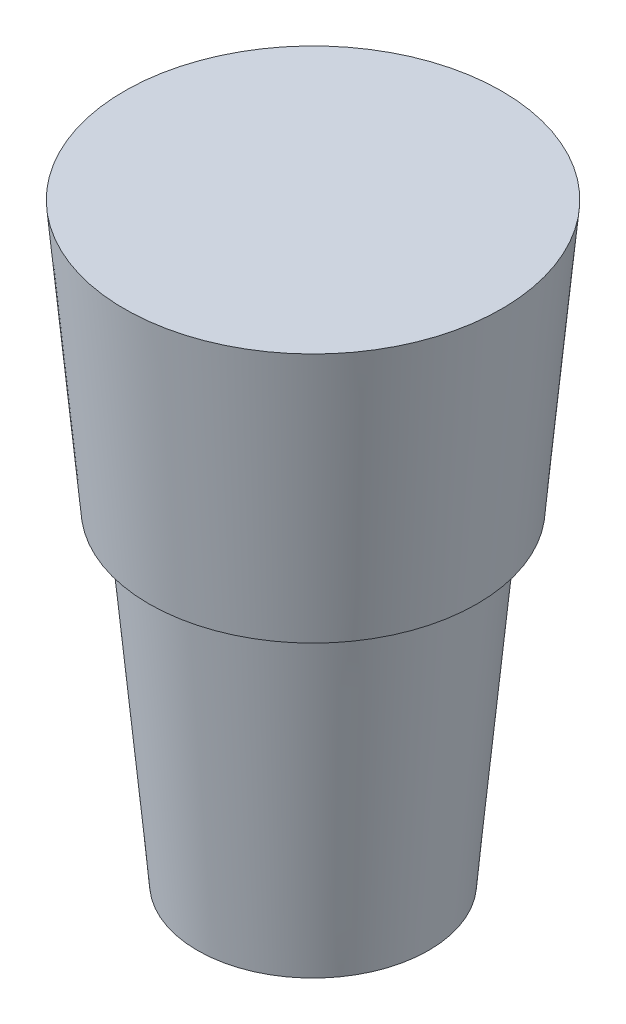
ISO-10303-21;
HEADER;
FILE_DESCRIPTION(('STEP AP214'),'2;1');
FILE_NAME('part.step','',(''),(''),'','','');
FILE_SCHEMA(('AUTOMOTIVE_DESIGN { 1 0 10303 214 1 1 1 1 }'));
ENDSEC;
DATA;
#1=APPLICATION_CONTEXT('core data for automotive mechanical design processes');
#2=APPLICATION_PROTOCOL_DEFINITION('international standard','automotive_design',2000,#1);
#3=PRODUCT_CONTEXT('',#1,'mechanical');
#4=PRODUCT('Part','Part','',(#3));
#5=PRODUCT_RELATED_PRODUCT_CATEGORY('part','',(#4));
#6=PRODUCT_DEFINITION_FORMATION('','',#4);
#7=PRODUCT_DEFINITION_CONTEXT('part definition',#1,'design');
#8=PRODUCT_DEFINITION('design','',#6,#7);
#9=PRODUCT_DEFINITION_SHAPE('','',#8);
#10=(LENGTH_UNIT() NAMED_UNIT(*) SI_UNIT(.MILLI.,.METRE.));
#11=(NAMED_UNIT(*) PLANE_ANGLE_UNIT() SI_UNIT($,.RADIAN.));
#12=(NAMED_UNIT(*) SI_UNIT($,.STERADIAN.) SOLID_ANGLE_UNIT());
#13=UNCERTAINTY_MEASURE_WITH_UNIT(LENGTH_MEASURE(1.E-05),#10,'distance_accuracy_value','');
#14=(GEOMETRIC_REPRESENTATION_CONTEXT(3) GLOBAL_UNCERTAINTY_ASSIGNED_CONTEXT((#13)) GLOBAL_UNIT_ASSIGNED_CONTEXT((#10,
#11,#12)) REPRESENTATION_CONTEXT('',''));
#15=CARTESIAN_POINT('',(0.,0.,0.));
#16=DIRECTION('',(0.,0.,1.));
#17=DIRECTION('',(1.,0.,0.));
#18=AXIS2_PLACEMENT_3D('',#15,#16,#17);
#19=CARTESIAN_POINT('',(-15.8031954179866,-39.1070249293181,0.));
#20=DIRECTION('',(0.,-1.,0.));
#21=DIRECTION('',(0.,0.,-1.));
#22=AXIS2_PLACEMENT_3D('',#19,#20,#21);
#23=PLANE('',#22);
#24=CARTESIAN_POINT('',(-15.8031954179866,-39.1070249293181,0.));
#25=DIRECTION('',(0.,-1.,0.));
#26=DIRECTION('',(0.,0.,-1.));
#27=AXIS2_PLACEMENT_3D('',#24,#25,#26);
#28=CIRCLE('',#27,24.13);
#29=CARTESIAN_POINT('',(-15.8031954179866,-39.1070249293181,-24.13));
#30=VERTEX_POINT('',#29);
#31=EDGE_CURVE('E10',#30,#30,#28,.T.);
#32=ORIENTED_EDGE('',*,*,#31,.T.);
#33=EDGE_LOOP('',(#32));
#34=FACE_BOUND('',#33,.T.);
#35=ADVANCED_FACE('F37',(#34),#23,.T.);
#36=CARTESIAN_POINT('',(-15.8031954179866,-39.1070249293181,0.));
#37=DIRECTION('',(0.,1.,0.));
#38=DIRECTION('',(0.,0.,1.));
#39=AXIS2_PLACEMENT_3D('',#36,#37,#38);
#40=CONICAL_SURFACE('',#39,24.13,0.0915683891808027);
#41=CARTESIAN_POINT('',(-15.8031954179866,25.6629750706819,0.));
#42=DIRECTION('',(0.,-1.,0.));
#43=DIRECTION('',(0.,0.,-1.));
#44=AXIS2_PLACEMENT_3D('',#41,#42,#43);
#45=CIRCLE('',#44,30.077516719638);
#46=CARTESIAN_POINT('',(-15.8031954179866,25.6629750706819,-30.077516719638));
#47=VERTEX_POINT('',#46);
#48=EDGE_CURVE('E44',#47,#47,#45,.T.);
#49=ORIENTED_EDGE('',*,*,#48,.T.);
#50=EDGE_LOOP('',(#49));
#51=FACE_BOUND('',#50,.T.);
#52=ORIENTED_EDGE('',*,*,#31,.F.);
#53=EDGE_LOOP('',(#52));
#54=FACE_BOUND('',#53,.T.);
#55=ADVANCED_FACE('F73',(#51,#54),#40,.T.);
#56=CARTESIAN_POINT('',(-15.8031954179866,25.6629750706819,0.));
#57=DIRECTION('',(0.,1.,0.));
#58=DIRECTION('',(0.,0.,1.));
#59=AXIS2_PLACEMENT_3D('',#56,#57,#58);
#60=CONICAL_SURFACE('',#59,30.077516719638,0.959931088596888);
#61=CARTESIAN_POINT('',(-15.8031954179866,28.5767433673452,0.));
#62=DIRECTION('',(0.,-1.,0.));
#63=DIRECTION('',(0.,0.,-1.));
#64=AXIS2_PLACEMENT_3D('',#61,#62,#63);
#65=CIRCLE('',#64,34.2388091046261);
#66=CARTESIAN_POINT('',(-15.8031954179866,28.5767433673452,-34.2388091046261));
#67=VERTEX_POINT('',#66);
#68=EDGE_CURVE('E49',#67,#67,#65,.T.);
#69=ORIENTED_EDGE('',*,*,#68,.T.);
#70=EDGE_LOOP('',(#69));
#71=FACE_BOUND('',#70,.T.);
#72=ORIENTED_EDGE('',*,*,#48,.F.);
#73=EDGE_LOOP('',(#72));
#74=FACE_BOUND('',#73,.T.);
#75=ADVANCED_FACE('F70',(#71,#74),#60,.T.);
#76=CARTESIAN_POINT('',(-15.8031954179866,28.5767433673452,0.));
#77=DIRECTION('',(0.,1.,0.));
#78=DIRECTION('',(0.,0.,1.));
#79=AXIS2_PLACEMENT_3D('',#76,#77,#78);
#80=CONICAL_SURFACE('',#79,34.2388091046261,0.0915683891808027);
#81=CARTESIAN_POINT('',(-15.8031954179866,84.4567433673452,0.));
#82=DIRECTION('',(0.,-1.,0.));
#83=DIRECTION('',(0.,0.,-1.));
#84=AXIS2_PLACEMENT_3D('',#81,#82,#83);
#85=CIRCLE('',#84,39.37);
#86=CARTESIAN_POINT('',(-15.8031954179866,84.4567433673452,-39.37));
#87=VERTEX_POINT('',#86);
#88=EDGE_CURVE('E54',#87,#87,#85,.T.);
#89=ORIENTED_EDGE('',*,*,#88,.T.);
#90=EDGE_LOOP('',(#89));
#91=FACE_BOUND('',#90,.T.);
#92=ORIENTED_EDGE('',*,*,#68,.F.);
#93=EDGE_LOOP('',(#92));
#94=FACE_BOUND('',#93,.T.);
#95=ADVANCED_FACE('F61',(#91,#94),#80,.T.);
#96=CARTESIAN_POINT('',(23.5668045820134,84.4567433673452,0.));
#97=DIRECTION('',(0.,1.,0.));
#98=DIRECTION('',(0.,0.,1.));
#99=AXIS2_PLACEMENT_3D('',#96,#97,#98);
#100=PLANE('',#99);
#101=ORIENTED_EDGE('',*,*,#88,.F.);
#102=EDGE_LOOP('',(#101));
#103=FACE_BOUND('',#102,.T.);
#104=ADVANCED_FACE('F64',(#103),#100,.T.);
#105=CLOSED_SHELL('',(#35,#55,#75,#95,#104));
#106=MANIFOLD_SOLID_BREP('B2',#105);
#107=ADVANCED_BREP_SHAPE_REPRESENTATION('',(#18,#106),#14);
#108=SHAPE_DEFINITION_REPRESENTATION(#9,#107);
ENDSEC;
END-ISO-10303-21;
